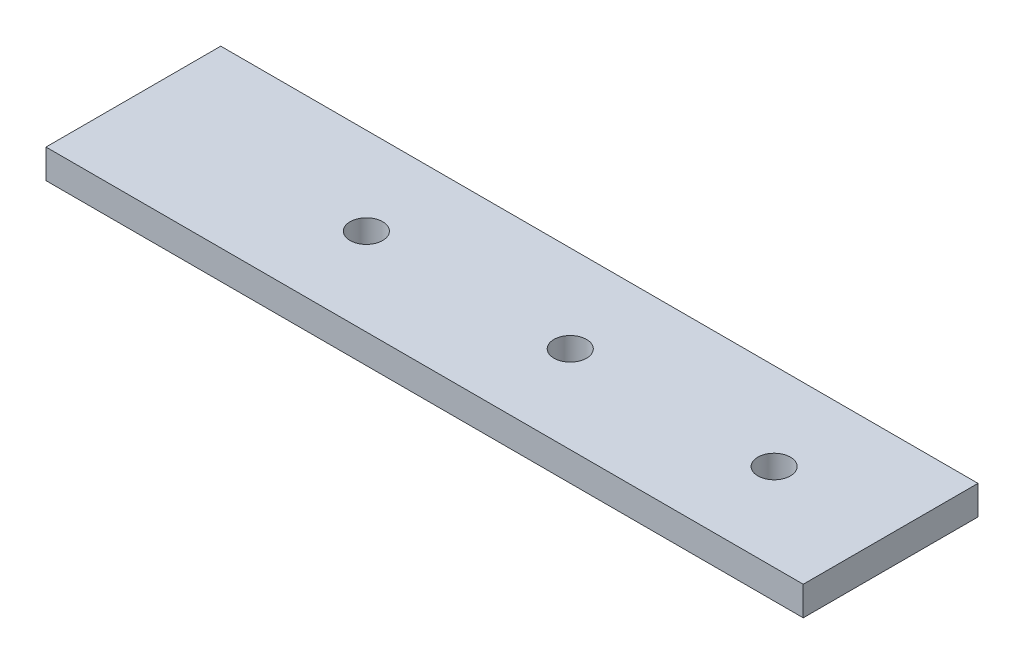
ISO-10303-21;
HEADER;
FILE_DESCRIPTION(('STEP AP214'),'2;1');
FILE_NAME('part.step','',(''),(''),'','','');
FILE_SCHEMA(('AUTOMOTIVE_DESIGN { 1 0 10303 214 1 1 1 1 }'));
ENDSEC;
DATA;
#1=APPLICATION_CONTEXT('core data for automotive mechanical design processes');
#2=APPLICATION_PROTOCOL_DEFINITION('international standard','automotive_design',2000,#1);
#3=PRODUCT_CONTEXT('',#1,'mechanical');
#4=PRODUCT('Part','Part','',(#3));
#5=PRODUCT_RELATED_PRODUCT_CATEGORY('part','',(#4));
#6=PRODUCT_DEFINITION_FORMATION('','',#4);
#7=PRODUCT_DEFINITION_CONTEXT('part definition',#1,'design');
#8=PRODUCT_DEFINITION('design','',#6,#7);
#9=PRODUCT_DEFINITION_SHAPE('','',#8);
#10=(LENGTH_UNIT() NAMED_UNIT(*) SI_UNIT(.MILLI.,.METRE.));
#11=(NAMED_UNIT(*) PLANE_ANGLE_UNIT() SI_UNIT($,.RADIAN.));
#12=(NAMED_UNIT(*) SI_UNIT($,.STERADIAN.) SOLID_ANGLE_UNIT());
#13=UNCERTAINTY_MEASURE_WITH_UNIT(LENGTH_MEASURE(1.E-05),#10,'distance_accuracy_value','');
#14=(GEOMETRIC_REPRESENTATION_CONTEXT(3) GLOBAL_UNCERTAINTY_ASSIGNED_CONTEXT((#13)) GLOBAL_UNIT_ASSIGNED_CONTEXT((#10,
#11,#12)) REPRESENTATION_CONTEXT('',''));
#15=CARTESIAN_POINT('',(0.,0.,0.));
#16=DIRECTION('',(0.,0.,1.));
#17=DIRECTION('',(1.,0.,0.));
#18=AXIS2_PLACEMENT_3D('',#15,#16,#17);
#19=CARTESIAN_POINT('',(0.,2.5,0.));
#20=DIRECTION('',(0.,-1.,0.));
#21=DIRECTION('',(0.,0.,-1.));
#22=AXIS2_PLACEMENT_3D('',#19,#20,#21);
#23=PLANE('',#22);
#24=DIRECTION('',(0.,0.,1.));
#25=VECTOR('',#24,1.);
#26=CARTESIAN_POINT('',(0.,2.5,0.));
#27=LINE('',#26,#25);
#28=CARTESIAN_POINT('',(0.,2.5,-15.));
#29=VERTEX_POINT('',#28);
#30=CARTESIAN_POINT('',(0.,2.5,0.));
#31=VERTEX_POINT('',#30);
#32=EDGE_CURVE('E85',#29,#31,#27,.T.);
#33=ORIENTED_EDGE('',*,*,#32,.T.);
#34=DIRECTION('',(1.,0.,0.));
#35=VECTOR('',#34,1.);
#36=CARTESIAN_POINT('',(0.,2.5,0.));
#37=LINE('',#36,#35);
#38=CARTESIAN_POINT('',(65.,2.5,0.));
#39=VERTEX_POINT('',#38);
#40=EDGE_CURVE('E80',#31,#39,#37,.T.);
#41=ORIENTED_EDGE('',*,*,#40,.T.);
#42=DIRECTION('',(0.,0.,-1.));
#43=VECTOR('',#42,1.);
#44=CARTESIAN_POINT('',(65.,2.5,0.));
#45=LINE('',#44,#43);
#46=CARTESIAN_POINT('',(65.,2.5,-15.));
#47=VERTEX_POINT('',#46);
#48=EDGE_CURVE('E83',#39,#47,#45,.T.);
#49=ORIENTED_EDGE('',*,*,#48,.T.);
#50=DIRECTION('',(-1.,0.,0.));
#51=VECTOR('',#50,1.);
#52=CARTESIAN_POINT('',(0.,2.5,-15.));
#53=LINE('',#52,#51);
#54=EDGE_CURVE('E50',#47,#29,#53,.T.);
#55=ORIENTED_EDGE('',*,*,#54,.T.);
#56=EDGE_LOOP('',(#33,#41,#49,#55));
#57=FACE_BOUND('',#56,.T.);
#58=CARTESIAN_POINT('',(55.,2.5,-7.5));
#59=DIRECTION('',(0.,1.,0.));
#60=DIRECTION('',(0.,0.,1.));
#61=AXIS2_PLACEMENT_3D('',#58,#59,#60);
#62=CIRCLE('',#61,1.4);
#63=CARTESIAN_POINT('',(55.,2.5,-6.1));
#64=VERTEX_POINT('',#63);
#65=EDGE_CURVE('E100',#64,#64,#62,.T.);
#66=ORIENTED_EDGE('',*,*,#65,.F.);
#67=EDGE_LOOP('',(#66));
#68=FACE_BOUND('',#67,.T.);
#69=CARTESIAN_POINT('',(37.5,2.5,-7.5));
#70=DIRECTION('',(0.,1.,0.));
#71=DIRECTION('',(0.,0.,1.));
#72=AXIS2_PLACEMENT_3D('',#69,#70,#71);
#73=CIRCLE('',#72,1.4);
#74=CARTESIAN_POINT('',(37.5,2.5,-6.1));
#75=VERTEX_POINT('',#74);
#76=EDGE_CURVE('E115',#75,#75,#73,.T.);
#77=ORIENTED_EDGE('',*,*,#76,.F.);
#78=EDGE_LOOP('',(#77));
#79=FACE_BOUND('',#78,.T.);
#80=CARTESIAN_POINT('',(20.,2.5,-7.5));
#81=DIRECTION('',(0.,1.,0.));
#82=DIRECTION('',(0.,0.,1.));
#83=AXIS2_PLACEMENT_3D('',#80,#81,#82);
#84=CIRCLE('',#83,1.4);
#85=CARTESIAN_POINT('',(20.,2.5,-6.1));
#86=VERTEX_POINT('',#85);
#87=EDGE_CURVE('E121',#86,#86,#84,.T.);
#88=ORIENTED_EDGE('',*,*,#87,.F.);
#89=EDGE_LOOP('',(#88));
#90=FACE_BOUND('',#89,.T.);
#91=ADVANCED_FACE('F33',(#57,#68,#79,#90),#23,.F.);
#92=CARTESIAN_POINT('',(0.,0.,0.));
#93=DIRECTION('',(0.,-1.,0.));
#94=DIRECTION('',(0.,0.,-1.));
#95=AXIS2_PLACEMENT_3D('',#92,#93,#94);
#96=PLANE('',#95);
#97=CARTESIAN_POINT('',(37.5,0.,-7.5));
#98=DIRECTION('',(0.,1.,0.));
#99=DIRECTION('',(0.,0.,1.));
#100=AXIS2_PLACEMENT_3D('',#97,#98,#99);
#101=CIRCLE('',#100,1.4);
#102=CARTESIAN_POINT('',(37.5,0.,-6.1));
#103=VERTEX_POINT('',#102);
#104=EDGE_CURVE('E118',#103,#103,#101,.T.);
#105=ORIENTED_EDGE('',*,*,#104,.T.);
#106=EDGE_LOOP('',(#105));
#107=FACE_BOUND('',#106,.T.);
#108=DIRECTION('',(0.,0.,1.));
#109=VECTOR('',#108,1.);
#110=CARTESIAN_POINT('',(0.,0.,0.));
#111=LINE('',#110,#109);
#112=CARTESIAN_POINT('',(0.,0.,-15.));
#113=VERTEX_POINT('',#112);
#114=CARTESIAN_POINT('',(0.,0.,0.));
#115=VERTEX_POINT('',#114);
#116=EDGE_CURVE('E97',#113,#115,#111,.T.);
#117=ORIENTED_EDGE('',*,*,#116,.F.);
#118=DIRECTION('',(-1.,0.,0.));
#119=VECTOR('',#118,1.);
#120=CARTESIAN_POINT('',(0.,0.,-15.));
#121=LINE('',#120,#119);
#122=CARTESIAN_POINT('',(65.,0.,-15.));
#123=VERTEX_POINT('',#122);
#124=EDGE_CURVE('E73',#123,#113,#121,.T.);
#125=ORIENTED_EDGE('',*,*,#124,.F.);
#126=DIRECTION('',(0.,0.,-1.));
#127=VECTOR('',#126,1.);
#128=CARTESIAN_POINT('',(65.,0.,0.));
#129=LINE('',#128,#127);
#130=CARTESIAN_POINT('',(65.,0.,0.));
#131=VERTEX_POINT('',#130);
#132=EDGE_CURVE('E67',#131,#123,#129,.T.);
#133=ORIENTED_EDGE('',*,*,#132,.F.);
#134=DIRECTION('',(1.,0.,0.));
#135=VECTOR('',#134,1.);
#136=CARTESIAN_POINT('',(0.,0.,0.));
#137=LINE('',#136,#135);
#138=EDGE_CURVE('E89',#115,#131,#137,.T.);
#139=ORIENTED_EDGE('',*,*,#138,.F.);
#140=EDGE_LOOP('',(#117,#125,#133,#139));
#141=FACE_BOUND('',#140,.T.);
#142=CARTESIAN_POINT('',(55.,0.,-7.5));
#143=DIRECTION('',(0.,1.,0.));
#144=DIRECTION('',(0.,0.,1.));
#145=AXIS2_PLACEMENT_3D('',#142,#143,#144);
#146=CIRCLE('',#145,1.4);
#147=CARTESIAN_POINT('',(55.,0.,-6.1));
#148=VERTEX_POINT('',#147);
#149=EDGE_CURVE('E112',#148,#148,#146,.T.);
#150=ORIENTED_EDGE('',*,*,#149,.T.);
#151=EDGE_LOOP('',(#150));
#152=FACE_BOUND('',#151,.T.);
#153=CARTESIAN_POINT('',(20.,0.,-7.5));
#154=DIRECTION('',(0.,1.,0.));
#155=DIRECTION('',(0.,0.,1.));
#156=AXIS2_PLACEMENT_3D('',#153,#154,#155);
#157=CIRCLE('',#156,1.4);
#158=CARTESIAN_POINT('',(20.,0.,-6.1));
#159=VERTEX_POINT('',#158);
#160=EDGE_CURVE('E124',#159,#159,#157,.T.);
#161=ORIENTED_EDGE('',*,*,#160,.T.);
#162=EDGE_LOOP('',(#161));
#163=FACE_BOUND('',#162,.T.);
#164=ADVANCED_FACE('F108',(#107,#141,#152,#163),#96,.T.);
#165=CARTESIAN_POINT('',(0.,2.5,0.));
#166=DIRECTION('',(1.,0.,0.));
#167=DIRECTION('',(0.,0.,-1.));
#168=AXIS2_PLACEMENT_3D('',#165,#166,#167);
#169=PLANE('',#168);
#170=ORIENTED_EDGE('',*,*,#116,.T.);
#171=DIRECTION('',(0.,-1.,0.));
#172=VECTOR('',#171,1.);
#173=CARTESIAN_POINT('',(0.,2.5,0.));
#174=LINE('',#173,#172);
#175=EDGE_CURVE('E11',#31,#115,#174,.T.);
#176=ORIENTED_EDGE('',*,*,#175,.F.);
#177=ORIENTED_EDGE('',*,*,#32,.F.);
#178=DIRECTION('',(0.,-1.,0.));
#179=VECTOR('',#178,1.);
#180=CARTESIAN_POINT('',(0.,2.5,-15.));
#181=LINE('',#180,#179);
#182=EDGE_CURVE('E93',#29,#113,#181,.T.);
#183=ORIENTED_EDGE('',*,*,#182,.T.);
#184=EDGE_LOOP('',(#170,#176,#177,#183));
#185=FACE_BOUND('',#184,.T.);
#186=ADVANCED_FACE('F35',(#185),#169,.F.);
#187=CARTESIAN_POINT('',(0.,2.5,0.));
#188=DIRECTION('',(0.,0.,-1.));
#189=DIRECTION('',(-1.,0.,0.));
#190=AXIS2_PLACEMENT_3D('',#187,#188,#189);
#191=PLANE('',#190);
#192=ORIENTED_EDGE('',*,*,#138,.T.);
#193=DIRECTION('',(0.,-1.,0.));
#194=VECTOR('',#193,1.);
#195=CARTESIAN_POINT('',(65.,2.5,0.));
#196=LINE('',#195,#194);
#197=EDGE_CURVE('E42',#39,#131,#196,.T.);
#198=ORIENTED_EDGE('',*,*,#197,.F.);
#199=ORIENTED_EDGE('',*,*,#40,.F.);
#200=ORIENTED_EDGE('',*,*,#175,.T.);
#201=EDGE_LOOP('',(#192,#198,#199,#200));
#202=FACE_BOUND('',#201,.T.);
#203=ADVANCED_FACE('F88',(#202),#191,.F.);
#204=CARTESIAN_POINT('',(65.,2.5,0.));
#205=DIRECTION('',(-1.,0.,0.));
#206=DIRECTION('',(0.,0.,1.));
#207=AXIS2_PLACEMENT_3D('',#204,#205,#206);
#208=PLANE('',#207);
#209=ORIENTED_EDGE('',*,*,#132,.T.);
#210=DIRECTION('',(0.,-1.,0.));
#211=VECTOR('',#210,1.);
#212=CARTESIAN_POINT('',(65.,2.5,-15.));
#213=LINE('',#212,#211);
#214=EDGE_CURVE('E90',#47,#123,#213,.T.);
#215=ORIENTED_EDGE('',*,*,#214,.F.);
#216=ORIENTED_EDGE('',*,*,#48,.F.);
#217=ORIENTED_EDGE('',*,*,#197,.T.);
#218=EDGE_LOOP('',(#209,#215,#216,#217));
#219=FACE_BOUND('',#218,.T.);
#220=ADVANCED_FACE('F91',(#219),#208,.F.);
#221=CARTESIAN_POINT('',(0.,2.5,-15.));
#222=DIRECTION('',(0.,0.,1.));
#223=DIRECTION('',(1.,0.,0.));
#224=AXIS2_PLACEMENT_3D('',#221,#222,#223);
#225=PLANE('',#224);
#226=ORIENTED_EDGE('',*,*,#124,.T.);
#227=ORIENTED_EDGE('',*,*,#182,.F.);
#228=ORIENTED_EDGE('',*,*,#54,.F.);
#229=ORIENTED_EDGE('',*,*,#214,.T.);
#230=EDGE_LOOP('',(#226,#227,#228,#229));
#231=FACE_BOUND('',#230,.T.);
#232=ADVANCED_FACE('F105',(#231),#225,.F.);
#233=CARTESIAN_POINT('',(55.,2.5,-7.5));
#234=DIRECTION('',(0.,-1.,0.));
#235=DIRECTION('',(0.,0.,-1.));
#236=AXIS2_PLACEMENT_3D('',#233,#234,#235);
#237=CYLINDRICAL_SURFACE('',#236,1.4);
#238=ORIENTED_EDGE('',*,*,#65,.T.);
#239=EDGE_LOOP('',(#238));
#240=FACE_BOUND('',#239,.T.);
#241=ORIENTED_EDGE('',*,*,#149,.F.);
#242=EDGE_LOOP('',(#241));
#243=FACE_BOUND('',#242,.T.);
#244=ADVANCED_FACE('F141',(#240,#243),#237,.F.);
#245=CARTESIAN_POINT('',(37.5,2.5,-7.5));
#246=DIRECTION('',(0.,-1.,0.));
#247=DIRECTION('',(0.,0.,-1.));
#248=AXIS2_PLACEMENT_3D('',#245,#246,#247);
#249=CYLINDRICAL_SURFACE('',#248,1.4);
#250=ORIENTED_EDGE('',*,*,#76,.T.);
#251=EDGE_LOOP('',(#250));
#252=FACE_BOUND('',#251,.T.);
#253=ORIENTED_EDGE('',*,*,#104,.F.);
#254=EDGE_LOOP('',(#253));
#255=FACE_BOUND('',#254,.T.);
#256=ADVANCED_FACE('F187',(#252,#255),#249,.F.);
#257=CARTESIAN_POINT('',(20.,2.5,-7.5));
#258=DIRECTION('',(0.,-1.,0.));
#259=DIRECTION('',(0.,0.,-1.));
#260=AXIS2_PLACEMENT_3D('',#257,#258,#259);
#261=CYLINDRICAL_SURFACE('',#260,1.4);
#262=ORIENTED_EDGE('',*,*,#87,.T.);
#263=EDGE_LOOP('',(#262));
#264=FACE_BOUND('',#263,.T.);
#265=ORIENTED_EDGE('',*,*,#160,.F.);
#266=EDGE_LOOP('',(#265));
#267=FACE_BOUND('',#266,.T.);
#268=ADVANCED_FACE('F130',(#264,#267),#261,.F.);
#269=CLOSED_SHELL('',(#91,#164,#186,#203,#220,#232,#244,#256,#268));
#270=MANIFOLD_SOLID_BREP('B2',#269);
#271=ADVANCED_BREP_SHAPE_REPRESENTATION('',(#18,#270),#14);
#272=SHAPE_DEFINITION_REPRESENTATION(#9,#271);
ENDSEC;
END-ISO-10303-21;
